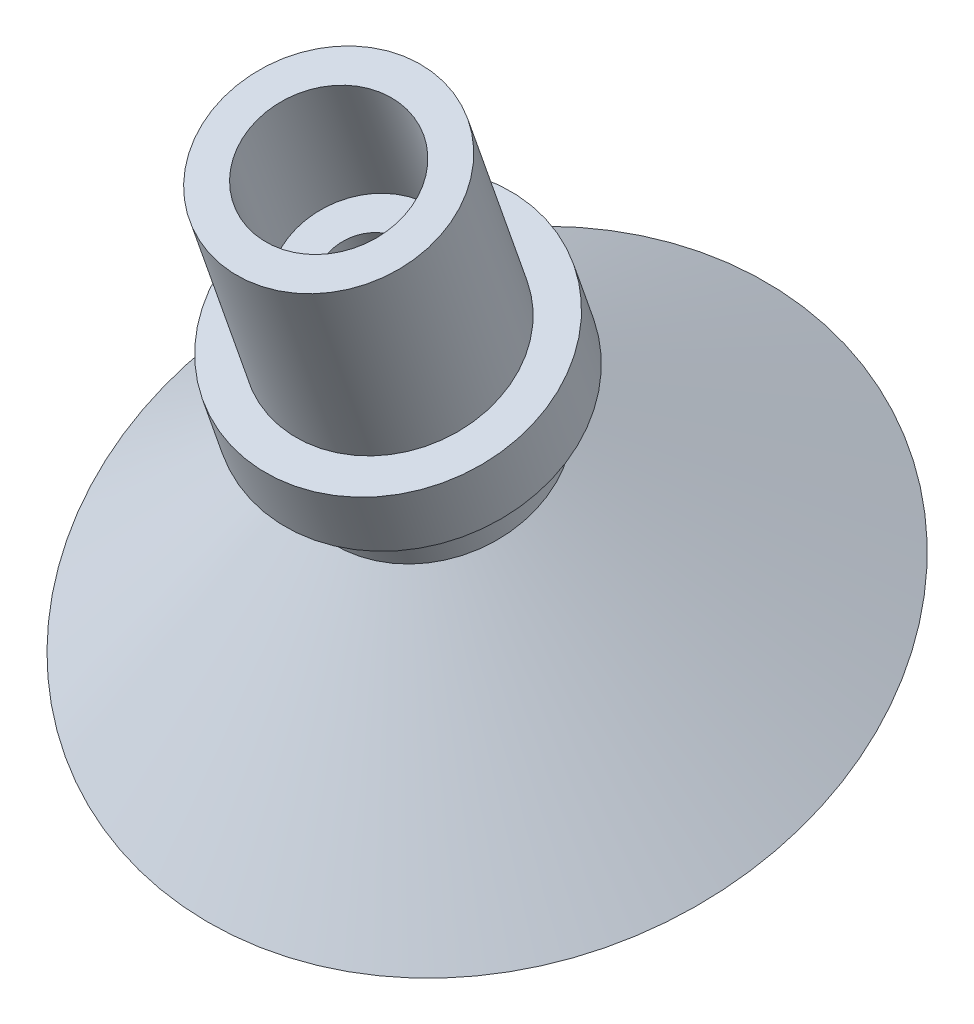
ISO-10303-21;
HEADER;
FILE_DESCRIPTION(('STEP AP214'),'2;1');
FILE_NAME('part.step','',(''),(''),'','','');
FILE_SCHEMA(('AUTOMOTIVE_DESIGN { 1 0 10303 214 1 1 1 1 }'));
ENDSEC;
DATA;
#1=APPLICATION_CONTEXT('core data for automotive mechanical design processes');
#2=APPLICATION_PROTOCOL_DEFINITION('international standard','automotive_design',2000,#1);
#3=PRODUCT_CONTEXT('',#1,'mechanical');
#4=PRODUCT('Part','Part','',(#3));
#5=PRODUCT_RELATED_PRODUCT_CATEGORY('part','',(#4));
#6=PRODUCT_DEFINITION_FORMATION('','',#4);
#7=PRODUCT_DEFINITION_CONTEXT('part definition',#1,'design');
#8=PRODUCT_DEFINITION('design','',#6,#7);
#9=PRODUCT_DEFINITION_SHAPE('','',#8);
#10=(LENGTH_UNIT() NAMED_UNIT(*) SI_UNIT(.MILLI.,.METRE.));
#11=(NAMED_UNIT(*) PLANE_ANGLE_UNIT() SI_UNIT($,.RADIAN.));
#12=(NAMED_UNIT(*) SI_UNIT($,.STERADIAN.) SOLID_ANGLE_UNIT());
#13=UNCERTAINTY_MEASURE_WITH_UNIT(LENGTH_MEASURE(1.E-05),#10,'distance_accuracy_value','');
#14=(GEOMETRIC_REPRESENTATION_CONTEXT(3) GLOBAL_UNCERTAINTY_ASSIGNED_CONTEXT((#13)) GLOBAL_UNIT_ASSIGNED_CONTEXT((#10,
#11,#12)) REPRESENTATION_CONTEXT('',''));
#15=CARTESIAN_POINT('',(0.,0.,0.));
#16=DIRECTION('',(0.,0.,1.));
#17=DIRECTION('',(1.,0.,0.));
#18=AXIS2_PLACEMENT_3D('',#15,#16,#17);
#19=CARTESIAN_POINT('',(-20.1513332773474,-35.9151658884174,4.65068208851449));
#20=DIRECTION('',(0.10380954475083,0.916038966713815,0.387422495320692));
#21=DIRECTION('',(0.,-0.389527034298012,0.921015032206856));
#22=AXIS2_PLACEMENT_3D('',#19,#20,#21);
#23=PLANE('',#22);
#24=CARTESIAN_POINT('',(-17.2535557984802,-35.9151658884174,3.87422495320692));
#25=DIRECTION('',(0.10380954475083,0.916038966713815,0.387422495320692));
#26=DIRECTION('',(0.,-0.389527034298012,0.921015032206856));
#27=AXIS2_PLACEMENT_3D('',#24,#25,#26);
#28=CIRCLE('',#27,3.);
#29=CARTESIAN_POINT('',(-17.2535557984802,-37.0837469913114,6.63727004982749));
#30=VERTEX_POINT('',#29);
#31=EDGE_CURVE('E10',#30,#30,#28,.T.);
#32=ORIENTED_EDGE('',*,*,#31,.T.);
#33=EDGE_LOOP('',(#32));
#34=FACE_BOUND('',#33,.T.);
#35=CARTESIAN_POINT('',(-17.2535557984802,-35.9151658884174,3.87422495320692));
#36=DIRECTION('',(0.10380954475083,0.916038966713815,0.387422495320692));
#37=DIRECTION('',(0.,-0.389527034298012,0.921015032206856));
#38=AXIS2_PLACEMENT_3D('',#35,#36,#37);
#39=CIRCLE('',#38,2.05);
#40=CARTESIAN_POINT('',(-17.2535557984802,-36.7136963087283,5.76230576923098));
#41=VERTEX_POINT('',#40);
#42=EDGE_CURVE('E84',#41,#41,#39,.T.);
#43=ORIENTED_EDGE('',*,*,#42,.F.);
#44=EDGE_LOOP('',(#43));
#45=FACE_BOUND('',#44,.T.);
#46=ADVANCED_FACE('F39',(#34,#45),#23,.T.);
#47=CARTESIAN_POINT('',(-17.2535557984802,-35.9151658884174,3.87422495320692));
#48=DIRECTION('',(0.10380954475083,0.916038966713815,0.387422495320692));
#49=DIRECTION('',(0.,-0.389527034298012,0.921015032206856));
#50=AXIS2_PLACEMENT_3D('',#47,#48,#49);
#51=CYLINDRICAL_SURFACE('',#50,3.);
#52=CARTESIAN_POINT('',(-17.8764130669852,-41.4113996887003,1.54968998128277));
#53=DIRECTION('',(0.10380954475083,0.916038966713815,0.387422495320692));
#54=DIRECTION('',(0.,-0.389527034298012,0.921015032206856));
#55=AXIS2_PLACEMENT_3D('',#52,#53,#54);
#56=CIRCLE('',#55,3.);
#57=CARTESIAN_POINT('',(-17.8764130669852,-42.5799807915943,4.31273507790334));
#58=VERTEX_POINT('',#57);
#59=EDGE_CURVE('E44',#58,#58,#56,.T.);
#60=ORIENTED_EDGE('',*,*,#59,.T.);
#61=EDGE_LOOP('',(#60));
#62=FACE_BOUND('',#61,.T.);
#63=ORIENTED_EDGE('',*,*,#31,.F.);
#64=EDGE_LOOP('',(#63));
#65=FACE_BOUND('',#64,.T.);
#66=ADVANCED_FACE('F123',(#62,#65),#51,.T.);
#67=CARTESIAN_POINT('',(-21.7401163721415,-41.4113996887003,2.58496616169287));
#68=DIRECTION('',(0.10380954475083,0.916038966713815,0.387422495320692));
#69=DIRECTION('',(0.,-0.389527034298012,0.921015032206856));
#70=AXIS2_PLACEMENT_3D('',#67,#68,#69);
#71=PLANE('',#70);
#72=CARTESIAN_POINT('',(-17.8764130669852,-41.4113996887003,1.54968998128277));
#73=DIRECTION('',(0.10380954475083,0.916038966713815,0.387422495320692));
#74=DIRECTION('',(0.,-0.389527034298012,0.921015032206856));
#75=AXIS2_PLACEMENT_3D('',#72,#73,#74);
#76=CIRCLE('',#75,3.99999999999999);
#77=CARTESIAN_POINT('',(-17.8764130669852,-42.9695078258923,5.23375011011019));
#78=VERTEX_POINT('',#77);
#79=EDGE_CURVE('E47',#78,#78,#76,.T.);
#80=ORIENTED_EDGE('',*,*,#79,.T.);
#81=EDGE_LOOP('',(#80));
#82=FACE_BOUND('',#81,.T.);
#83=ORIENTED_EDGE('',*,*,#59,.F.);
#84=EDGE_LOOP('',(#83));
#85=FACE_BOUND('',#84,.T.);
#86=ADVANCED_FACE('F124',(#82,#85),#71,.T.);
#87=CARTESIAN_POINT('',(-17.2535557984802,-35.9151658884174,3.87422495320692));
#88=DIRECTION('',(0.10380954475083,0.916038966713815,0.387422495320692));
#89=DIRECTION('',(0.,-0.389527034298012,0.921015032206856));
#90=AXIS2_PLACEMENT_3D('',#87,#88,#89);
#91=CYLINDRICAL_SURFACE('',#90,4.);
#92=CARTESIAN_POINT('',(-18.0840321564869,-43.2434776221279,0.774844990641381));
#93=DIRECTION('',(0.10380954475083,0.916038966713815,0.387422495320692));
#94=DIRECTION('',(0.,-0.389527034298012,0.921015032206856));
#95=AXIS2_PLACEMENT_3D('',#92,#93,#94);
#96=CIRCLE('',#95,4.);
#97=CARTESIAN_POINT('',(-18.0840321564869,-44.80158575932,4.4589051194688));
#98=VERTEX_POINT('',#97);
#99=EDGE_CURVE('E52',#98,#98,#96,.T.);
#100=ORIENTED_EDGE('',*,*,#99,.T.);
#101=EDGE_LOOP('',(#100));
#102=FACE_BOUND('',#101,.T.);
#103=ORIENTED_EDGE('',*,*,#79,.F.);
#104=EDGE_LOOP('',(#103));
#105=FACE_BOUND('',#104,.T.);
#106=ADVANCED_FACE('F119',(#102,#105),#91,.T.);
#107=CARTESIAN_POINT('',(-20.9818096353541,-43.2434776221279,1.55130212594895));
#108=DIRECTION('',(-0.10380954475083,-0.916038966713815,-0.387422495320692));
#109=DIRECTION('',(0.,0.389527034298012,-0.921015032206856));
#110=AXIS2_PLACEMENT_3D('',#107,#108,#109);
#111=PLANE('',#110);
#112=CARTESIAN_POINT('',(-18.0840321564869,-43.2434776221279,0.774844990641381));
#113=DIRECTION('',(0.10380954475083,0.916038966713815,0.387422495320692));
#114=DIRECTION('',(0.,-0.389527034298012,0.921015032206856));
#115=AXIS2_PLACEMENT_3D('',#112,#113,#114);
#116=CIRCLE('',#115,3.);
#117=CARTESIAN_POINT('',(-18.0840321564869,-44.412058725022,3.53789008726195));
#118=VERTEX_POINT('',#117);
#119=EDGE_CURVE('E59',#118,#118,#116,.T.);
#120=ORIENTED_EDGE('',*,*,#119,.T.);
#121=EDGE_LOOP('',(#120));
#122=FACE_BOUND('',#121,.T.);
#123=ORIENTED_EDGE('',*,*,#99,.F.);
#124=EDGE_LOOP('',(#123));
#125=FACE_BOUND('',#124,.T.);
#126=ADVANCED_FACE('F111',(#122,#125),#111,.T.);
#127=CARTESIAN_POINT('',(-17.2535557984802,-35.9151658884174,3.87422495320692));
#128=DIRECTION('',(0.10380954475083,0.916038966713815,0.387422495320692));
#129=DIRECTION('',(0.,-0.389527034298012,0.921015032206856));
#130=AXIS2_PLACEMENT_3D('',#127,#128,#129);
#131=CYLINDRICAL_SURFACE('',#130,3.);
#132=CARTESIAN_POINT('',(-18.2916512459885,-45.0755555555555,0.));
#133=DIRECTION('',(0.10380954475083,0.916038966713815,0.387422495320692));
#134=DIRECTION('',(0.,-0.389527034298012,0.921015032206856));
#135=AXIS2_PLACEMENT_3D('',#132,#133,#134);
#136=CIRCLE('',#135,3.);
#137=CARTESIAN_POINT('',(-18.2916512459885,-43.9069744526615,-2.76304509662056));
#138=VERTEX_POINT('',#137);
#139=EDGE_CURVE('E62',#138,#138,#136,.T.);
#140=ORIENTED_EDGE('',*,*,#139,.T.);
#141=EDGE_LOOP('',(#140));
#142=FACE_BOUND('',#141,.T.);
#143=ORIENTED_EDGE('',*,*,#119,.F.);
#144=EDGE_LOOP('',(#143));
#145=FACE_BOUND('',#144,.T.);
#146=ADVANCED_FACE('F109',(#142,#145),#131,.T.);
#147=CARTESIAN_POINT('',(-18.2916512459885,-45.0755555555555,0.));
#148=DIRECTION('',(-0.10380954475083,-0.916038966713815,-0.387422495320692));
#149=DIRECTION('',(0.,0.389527034298012,-0.921015032206856));
#150=AXIS2_PLACEMENT_3D('',#147,#148,#149);
#151=CONICAL_SURFACE('',#150,3.,0.793662438057099);
#152=CARTESIAN_POINT('',(-18.9145085144935,-50.5717893558384,-2.32453497192415));
#153=DIRECTION('',(0.10380954475083,0.916038966713815,0.387422495320692));
#154=DIRECTION('',(0.,-0.389527034298012,0.921015032206856));
#155=AXIS2_PLACEMENT_3D('',#152,#153,#154);
#156=CIRCLE('',#155,9.09999999999999);
#157=CARTESIAN_POINT('',(-18.9145085144935,-47.0270933437265,-10.7057717650065));
#158=VERTEX_POINT('',#157);
#159=EDGE_CURVE('E61',#158,#158,#156,.T.);
#160=CARTESIAN_POINT('',(-18.9145085144935,-47.0270933437265,-10.7057717650065));
#161=CARTESIAN_POINT('',(-18.9080204179466,-46.9945921052779,-10.6230350288775));
#162=CARTESIAN_POINT('',(-18.9015323213996,-46.9620908668293,-10.5402982927485));
#163=CARTESIAN_POINT('',(-18.8885561283058,-46.8970883899322,-10.3748248204905));
#164=CARTESIAN_POINT('',(-18.8820680317589,-46.8645871514836,-10.2920880843614));
#165=CARTESIAN_POINT('',(-18.869091838665,-46.7995846745864,-10.1266146121034));
#166=CARTESIAN_POINT('',(-18.8626037421181,-46.7670834361378,-10.0438778759744));
#167=CARTESIAN_POINT('',(-18.8496275490242,-46.7020809592406,-9.87840440371633));
#168=CARTESIAN_POINT('',(-18.8431394524773,-46.669579720792,-9.79566766758731));
#169=CARTESIAN_POINT('',(-18.8301632593835,-46.6045772438948,-9.63019419532927));
#170=CARTESIAN_POINT('',(-18.8236751628365,-46.5720760054462,-9.54745745920025));
#171=CARTESIAN_POINT('',(-18.8106989697427,-46.507073528549,-9.3819839869422));
#172=CARTESIAN_POINT('',(-18.8042108731957,-46.4745722901004,-9.29924725081318));
#173=CARTESIAN_POINT('',(-18.7912346801019,-46.4095698132032,-9.13377377855514));
#174=CARTESIAN_POINT('',(-18.784746583555,-46.3770685747546,-9.05103704242612));
#175=CARTESIAN_POINT('',(-18.7717703904611,-46.3120660978575,-8.88556357016808));
#176=CARTESIAN_POINT('',(-18.7652822939142,-46.2795648594089,-8.80282683403906));
#177=CARTESIAN_POINT('',(-18.7523061008203,-46.2145623825117,-8.63735336178102));
#178=CARTESIAN_POINT('',(-18.7458180042734,-46.1820611440631,-8.554616625652));
#179=CARTESIAN_POINT('',(-18.7328418111795,-46.1170586671659,-8.38914315339396));
#180=CARTESIAN_POINT('',(-18.7263537146326,-46.0845574287173,-8.30640641726494));
#181=CARTESIAN_POINT('',(-18.7133775215388,-46.0195549518201,-8.1409329450069));
#182=CARTESIAN_POINT('',(-18.7068894249918,-45.9870537133715,-8.05819620887788));
#183=CARTESIAN_POINT('',(-18.693913231898,-45.9220512364743,-7.89272273661984));
#184=CARTESIAN_POINT('',(-18.6874251353511,-45.8895499980257,-7.80998600049082));
#185=CARTESIAN_POINT('',(-18.6744489422572,-45.8245475211286,-7.64451252823277));
#186=CARTESIAN_POINT('',(-18.6679608457103,-45.79204628268,-7.56177579210375));
#187=CARTESIAN_POINT('',(-18.6549846526164,-45.7270438057828,-7.39630231984571));
#188=CARTESIAN_POINT('',(-18.6484965560695,-45.6945425673342,-7.31356558371669));
#189=CARTESIAN_POINT('',(-18.6355203629756,-45.629540090437,-7.14809211145865));
#190=CARTESIAN_POINT('',(-18.6290322664287,-45.5970388519884,-7.06535537532963));
#191=CARTESIAN_POINT('',(-18.6160560733349,-45.5320363750912,-6.89988190307159));
#192=CARTESIAN_POINT('',(-18.6095679767879,-45.4995351366426,-6.81714516694257));
#193=CARTESIAN_POINT('',(-18.5965917836941,-45.4345326597454,-6.65167169468453));
#194=CARTESIAN_POINT('',(-18.5901036871472,-45.4020314212968,-6.56893495855551));
#195=CARTESIAN_POINT('',(-18.5771274940533,-45.3370289443996,-6.40346148629747));
#196=CARTESIAN_POINT('',(-18.5706393975064,-45.3045277059511,-6.32072475016844));
#197=CARTESIAN_POINT('',(-18.5576632044125,-45.2395252290539,-6.1552512779104));
#198=CARTESIAN_POINT('',(-18.5511751078656,-45.2070239906053,-6.07251454178138));
#199=CARTESIAN_POINT('',(-18.5381989147717,-45.1420215137081,-5.90704106952334));
#200=CARTESIAN_POINT('',(-18.5317108182248,-45.1095202752595,-5.82430433339432));
#201=CARTESIAN_POINT('',(-18.518734625131,-45.0445177983623,-5.65883086113628));
#202=CARTESIAN_POINT('',(-18.512246528584,-45.0120165599137,-5.57609412500726));
#203=CARTESIAN_POINT('',(-18.4992703354902,-44.9470140830165,-5.41062065274922));
#204=CARTESIAN_POINT('',(-18.4927822389432,-44.9145128445679,-5.3278839166202));
#205=CARTESIAN_POINT('',(-18.4798060458494,-44.8495103676707,-5.16241044436216));
#206=CARTESIAN_POINT('',(-18.4733179493025,-44.8170091292221,-5.07967370823314));
#207=CARTESIAN_POINT('',(-18.4603417562086,-44.752006652325,-4.9142002359751));
#208=CARTESIAN_POINT('',(-18.4538536596617,-44.7195054138764,-4.83146349984608));
#209=CARTESIAN_POINT('',(-18.4408774665678,-44.6545029369792,-4.66599002758803));
#210=CARTESIAN_POINT('',(-18.4343893700209,-44.6220016985306,-4.58325329145901));
#211=CARTESIAN_POINT('',(-18.4214131769271,-44.5569992216334,-4.41777981920097));
#212=CARTESIAN_POINT('',(-18.4149250803801,-44.5244979831848,-4.33504308307195));
#213=CARTESIAN_POINT('',(-18.4019488872863,-44.4594955062876,-4.16956961081391));
#214=CARTESIAN_POINT('',(-18.3954607907393,-44.426994267839,-4.08683287468489));
#215=CARTESIAN_POINT('',(-18.3824845976455,-44.3619917909418,-3.92135940242685));
#216=CARTESIAN_POINT('',(-18.3759965010986,-44.3294905524932,-3.83862266629783));
#217=CARTESIAN_POINT('',(-18.3630203080047,-44.2644880755961,-3.67314919403979));
#218=CARTESIAN_POINT('',(-18.3565322114578,-44.2319868371475,-3.59041245791077));
#219=CARTESIAN_POINT('',(-18.3435560183639,-44.1669843602503,-3.42493898565273));
#220=CARTESIAN_POINT('',(-18.337067921817,-44.1344831218017,-3.34220224952371));
#221=CARTESIAN_POINT('',(-18.3240917287232,-44.0694806449045,-3.17672877726567));
#222=CARTESIAN_POINT('',(-18.3176036321762,-44.0369794064559,-3.09399204113664));
#223=CARTESIAN_POINT('',(-18.3046274390824,-43.9719769295587,-2.9285185688786));
#224=CARTESIAN_POINT('',(-18.2981393425354,-43.9394756911101,-2.84578183274958));
#225=CARTESIAN_POINT('',(-18.2916512459885,-43.9069744526615,-2.76304509662056));
#226=B_SPLINE_CURVE_WITH_KNOTS('',3,(#160,#161,#162,#163,#164,#165,#166,#167,#168,#169,#170,
#171,#172,#173,#174,#175,#176,#177,#178,#179,#180,#181,#182,#183,#184,#185,#186,#187,#188,#189,
#190,#191,#192,#193,#194,#195,#196,#197,#198,#199,#200,#201,#202,#203,#204,#205,#206,#207,#208,
#209,#210,#211,#212,#213,#214,#215,#216,#217,#218,#219,#220,#221,#222,#223,#224,#225),
.UNSPECIFIED.,.F.,.F.,(4,2,2,2,2,2,2,2,2,2,2,2,2,2,2,2,2,2,2,2,2,2,2,2,2,2,2,2,2,2,2,2,4),(0.,
0.267383882507905,0.534767765015809,0.802151647523712,1.06953553003161,1.33691941253952,
1.60430329504742,1.87168717755532,2.13907106006323,2.40645494257113,2.67383882507903,
2.94122270758693,3.20860659009484,3.47599047260274,3.74337435511064,4.01075823761855,
4.27814212012645,4.54552600263435,4.81290988514225,5.08029376765015,5.34767765015806,
5.61506153266596,5.88244541517386,6.14982929768177,6.41721318018967,6.68459706269757,
6.95198094520548,7.21936482771338,7.48674871022128,7.75413259272919,8.02151647523709,
8.28890035774499,8.55628424025289),.UNSPECIFIED.);
#227=EDGE_CURVE('BSEAM106',#158,#138,#226,.T.);
#228=ORIENTED_EDGE('',*,*,#159,.T.);
#229=ORIENTED_EDGE('',*,*,#139,.F.);
#230=ORIENTED_EDGE('',*,*,#227,.T.);
#231=ORIENTED_EDGE('',*,*,#227,.F.);
#232=EDGE_LOOP('',(#228,#230,#229,#231));
#233=FACE_BOUND('',#232,.T.);
#234=ADVANCED_FACE('F106',(#233),#151,.T.);
#235=CARTESIAN_POINT('',(-26.7385077074349,-50.5717893558384,-0.228100706593717));
#236=DIRECTION('',(-0.10380954475083,-0.916038966713815,-0.387422495320692));
#237=DIRECTION('',(0.,0.389527034298012,-0.921015032206856));
#238=AXIS2_PLACEMENT_3D('',#235,#236,#237);
#239=PLANE('',#238);
#240=CARTESIAN_POINT('',(-18.9145085144935,-50.5717893558384,-2.32453497192415));
#241=DIRECTION('',(0.10380954475083,0.916038966713815,0.387422495320692));
#242=DIRECTION('',(0.,-0.389527034298012,0.921015032206856));
#243=AXIS2_PLACEMENT_3D('',#240,#241,#242);
#244=CIRCLE('',#243,8.1);
#245=CARTESIAN_POINT('',(-18.9145085144935,-53.7269583336523,5.13568678895138));
#246=VERTEX_POINT('',#245);
#247=EDGE_CURVE('E69',#246,#246,#244,.T.);
#248=ORIENTED_EDGE('',*,*,#247,.T.);
#249=EDGE_LOOP('',(#248));
#250=FACE_BOUND('',#249,.T.);
#251=ORIENTED_EDGE('',*,*,#159,.F.);
#252=EDGE_LOOP('',(#251));
#253=FACE_BOUND('',#252,.T.);
#254=ADVANCED_FACE('F105',(#250,#253),#239,.T.);
#255=CARTESIAN_POINT('',(-18.2916512459885,-45.0755555555556,0.));
#256=DIRECTION('',(0.10380954475083,0.916038966713815,0.387422495320692));
#257=DIRECTION('',(0.,-0.389527034298012,0.921015032206856));
#258=AXIS2_PLACEMENT_3D('',#255,#256,#257);
#259=TOROIDAL_SURFACE('',#258,8.1,6.);
#260=CARTESIAN_POINT('',(-18.2916512459885,-45.0755555555556,0.));
#261=DIRECTION('',(0.10380954475083,0.916038966713815,0.387422495320692));
#262=DIRECTION('',(0.,-0.389527034298012,0.921015032206856));
#263=AXIS2_PLACEMENT_3D('',#260,#261,#262);
#264=CIRCLE('',#263,2.1);
#265=CARTESIAN_POINT('',(-18.2916512459885,-45.8935623275814,1.93413156763439));
#266=VERTEX_POINT('',#265);
#267=EDGE_CURVE('E68',#266,#266,#264,.T.);
#268=ORIENTED_EDGE('',*,*,#267,.T.);
#269=EDGE_LOOP('',(#268));
#270=FACE_BOUND('',#269,.T.);
#271=ORIENTED_EDGE('',*,*,#247,.F.);
#272=EDGE_LOOP('',(#271));
#273=FACE_BOUND('',#272,.T.);
#274=ADVANCED_FACE('F100',(#270,#273),#259,.T.);
#275=CARTESIAN_POINT('',(-20.3200954811956,-45.0755555555556,0.543519994715306));
#276=CARTESIAN_POINT('',(-20.2508891180283,-44.4648629110797,0.801801658262437));
#277=CARTESIAN_POINT('',(-19.215756928572,-43.8541702666038,0.80126427670704));
#278=CARTESIAN_POINT('',(-19.1465505654048,-43.2434776221279,1.05954594025416));
#279=B_SPLINE_CURVE_WITH_KNOTS('',3,(#275,#276,#277,#278),.UNSPECIFIED.,.F.,.F.,(4,4),(0.,1.),.UNSPECIFIED.);
#280=CARTESIAN_POINT('',(-17.2535557984802,-35.9151658884174,3.87422495320692));
#281=DIRECTION('',(0.10380954475083,0.916038966713815,0.387422495320692));
#282=AXIS1_PLACEMENT('',#280,#281);
#283=SURFACE_OF_REVOLUTION('',#279,#282);
#284=CARTESIAN_POINT('',(-18.0840321564869,-43.2434776221279,0.774844990641379));
#285=DIRECTION('',(0.10380954475083,0.916038966713815,0.387422495320692));
#286=DIRECTION('',(0.,-0.389527034298012,0.921015032206856));
#287=AXIS2_PLACEMENT_3D('',#284,#285,#286);
#288=CIRCLE('',#287,1.09999999999999);
#289=CARTESIAN_POINT('',(-18.0840321564869,-43.6719573598558,1.78796152606891));
#290=VERTEX_POINT('',#289);
#291=EDGE_CURVE('E71',#290,#290,#288,.T.);
#292=ORIENTED_EDGE('',*,*,#291,.T.);
#293=EDGE_LOOP('',(#292));
#294=FACE_BOUND('',#293,.T.);
#295=ORIENTED_EDGE('',*,*,#267,.F.);
#296=EDGE_LOOP('',(#295));
#297=FACE_BOUND('',#296,.T.);
#298=ADVANCED_FACE('F95',(#294,#297),#283,.F.);
#299=CARTESIAN_POINT('',(-17.2535557984802,-35.9151658884174,3.87422495320692));
#300=DIRECTION('',(0.10380954475083,0.916038966713815,0.387422495320692));
#301=DIRECTION('',(0.,-0.389527034298012,0.921015032206856));
#302=AXIS2_PLACEMENT_3D('',#299,#300,#301);
#303=CYLINDRICAL_SURFACE('',#302,1.09999999999999);
#304=CARTESIAN_POINT('',(-17.6687939774835,-39.5793217552727,2.32453497192415));
#305=DIRECTION('',(0.10380954475083,0.916038966713815,0.387422495320692));
#306=DIRECTION('',(0.,-0.389527034298012,0.921015032206856));
#307=AXIS2_PLACEMENT_3D('',#304,#305,#306);
#308=CIRCLE('',#307,1.1);
#309=CARTESIAN_POINT('',(-17.6687939774835,-40.0078014930005,3.33765150735169));
#310=VERTEX_POINT('',#309);
#311=EDGE_CURVE('E77',#310,#310,#308,.T.);
#312=ORIENTED_EDGE('',*,*,#311,.T.);
#313=EDGE_LOOP('',(#312));
#314=FACE_BOUND('',#313,.T.);
#315=ORIENTED_EDGE('',*,*,#291,.F.);
#316=EDGE_LOOP('',(#315));
#317=FACE_BOUND('',#316,.T.);
#318=ADVANCED_FACE('F96',(#314,#317),#303,.F.);
#319=CARTESIAN_POINT('',(-19.6489419213761,-39.5793217552727,2.85511401438433));
#320=DIRECTION('',(0.10380954475083,0.916038966713815,0.387422495320692));
#321=DIRECTION('',(0.,-0.389527034298012,0.921015032206856));
#322=AXIS2_PLACEMENT_3D('',#319,#320,#321);
#323=PLANE('',#322);
#324=CARTESIAN_POINT('',(-17.6687939774835,-39.5793217552727,2.32453497192415));
#325=DIRECTION('',(0.10380954475083,0.916038966713815,0.387422495320692));
#326=DIRECTION('',(0.,-0.389527034298012,0.921015032206856));
#327=AXIS2_PLACEMENT_3D('',#324,#325,#326);
#328=CIRCLE('',#327,2.04999999999999);
#329=CARTESIAN_POINT('',(-17.6687939774835,-40.3778521755836,4.2126157879482));
#330=VERTEX_POINT('',#329);
#331=EDGE_CURVE('E76',#330,#330,#328,.T.);
#332=ORIENTED_EDGE('',*,*,#331,.T.);
#333=EDGE_LOOP('',(#332));
#334=FACE_BOUND('',#333,.T.);
#335=ORIENTED_EDGE('',*,*,#311,.F.);
#336=EDGE_LOOP('',(#335));
#337=FACE_BOUND('',#336,.T.);
#338=ADVANCED_FACE('F138',(#334,#337),#323,.T.);
#339=CARTESIAN_POINT('',(-17.2535557984802,-35.9151658884174,3.87422495320692));
#340=DIRECTION('',(0.10380954475083,0.916038966713815,0.387422495320692));
#341=DIRECTION('',(0.,-0.389527034298012,0.921015032206856));
#342=AXIS2_PLACEMENT_3D('',#339,#340,#341);
#343=CYLINDRICAL_SURFACE('',#342,2.05);
#344=ORIENTED_EDGE('',*,*,#42,.T.);
#345=EDGE_LOOP('',(#344));
#346=FACE_BOUND('',#345,.T.);
#347=ORIENTED_EDGE('',*,*,#331,.F.);
#348=EDGE_LOOP('',(#347));
#349=FACE_BOUND('',#348,.T.);
#350=ADVANCED_FACE('F139',(#346,#349),#343,.F.);
#351=CLOSED_SHELL('',(#46,#66,#86,#106,#126,#146,#234,#254,#274,#298,#318,#338,#350));
#352=MANIFOLD_SOLID_BREP('B2',#351);
#353=ADVANCED_BREP_SHAPE_REPRESENTATION('',(#18,#352),#14);
#354=SHAPE_DEFINITION_REPRESENTATION(#9,#353);
ENDSEC;
END-ISO-10303-21;
